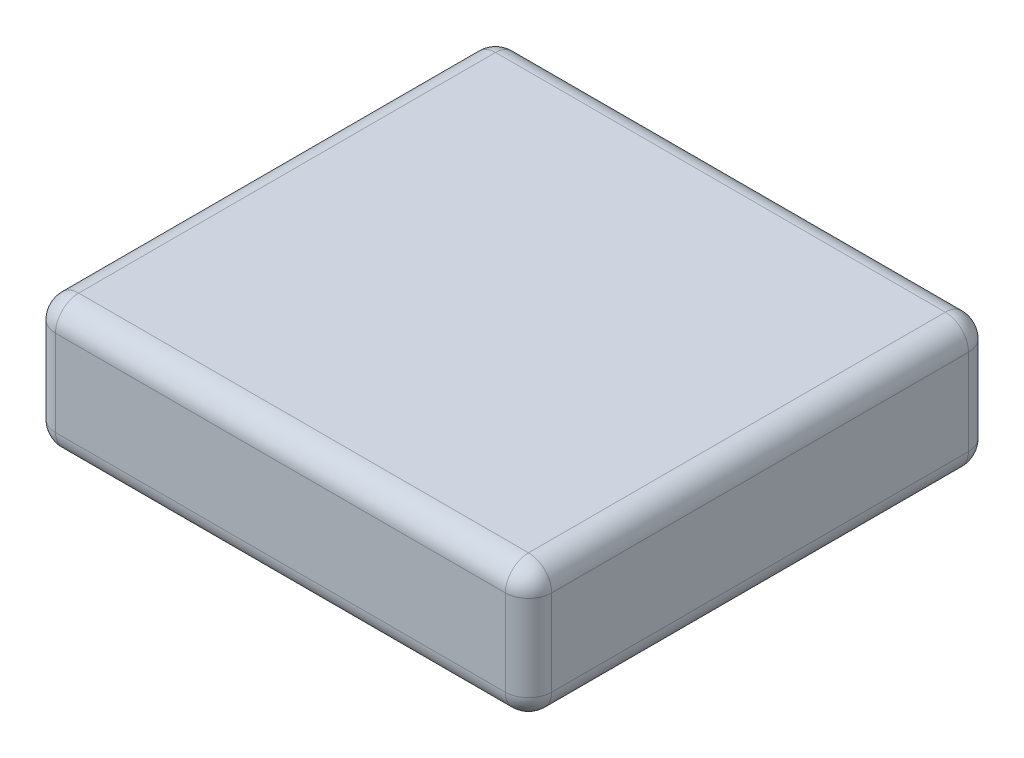
ISO-10303-21;
HEADER;
FILE_DESCRIPTION(('STEP AP214'),'2;1');
FILE_NAME('part.step','',(''),(''),'','','');
FILE_SCHEMA(('AUTOMOTIVE_DESIGN { 1 0 10303 214 1 1 1 1 }'));
ENDSEC;
DATA;
#1=APPLICATION_CONTEXT('core data for automotive mechanical design processes');
#2=APPLICATION_PROTOCOL_DEFINITION('international standard','automotive_design',2000,#1);
#3=PRODUCT_CONTEXT('',#1,'mechanical');
#4=PRODUCT('Part','Part','',(#3));
#5=PRODUCT_RELATED_PRODUCT_CATEGORY('part','',(#4));
#6=PRODUCT_DEFINITION_FORMATION('','',#4);
#7=PRODUCT_DEFINITION_CONTEXT('part definition',#1,'design');
#8=PRODUCT_DEFINITION('design','',#6,#7);
#9=PRODUCT_DEFINITION_SHAPE('','',#8);
#10=(LENGTH_UNIT() NAMED_UNIT(*) SI_UNIT(.MILLI.,.METRE.));
#11=(NAMED_UNIT(*) PLANE_ANGLE_UNIT() SI_UNIT($,.RADIAN.));
#12=(NAMED_UNIT(*) SI_UNIT($,.STERADIAN.) SOLID_ANGLE_UNIT());
#13=UNCERTAINTY_MEASURE_WITH_UNIT(LENGTH_MEASURE(1.E-05),#10,'distance_accuracy_value','');
#14=(GEOMETRIC_REPRESENTATION_CONTEXT(3) GLOBAL_UNCERTAINTY_ASSIGNED_CONTEXT((#13)) GLOBAL_UNIT_ASSIGNED_CONTEXT((#10,
#11,#12)) REPRESENTATION_CONTEXT('',''));
#15=CARTESIAN_POINT('',(0.,0.,0.));
#16=DIRECTION('',(0.,0.,1.));
#17=DIRECTION('',(1.,0.,0.));
#18=AXIS2_PLACEMENT_3D('',#15,#16,#17);
#19=CARTESIAN_POINT('',(0.,200.,0.));
#20=DIRECTION('',(1.,0.,0.));
#21=DIRECTION('',(0.,0.,-1.));
#22=AXIS2_PLACEMENT_3D('',#19,#20,#21);
#23=PLANE('',#22);
#24=DIRECTION('',(0.,-1.,0.));
#25=VECTOR('',#24,1.);
#26=CARTESIAN_POINT('',(0.,200.,-35.));
#27=LINE('',#26,#25);
#28=CARTESIAN_POINT('',(0.,35.,-35.));
#29=VERTEX_POINT('',#28);
#30=CARTESIAN_POINT('',(0.,165.,-35.));
#31=VERTEX_POINT('',#30);
#32=EDGE_CURVE('E129',#29,#31,#27,.F.);
#33=ORIENTED_EDGE('',*,*,#32,.T.);
#34=DIRECTION('',(0.,0.,1.));
#35=VECTOR('',#34,1.);
#36=CARTESIAN_POINT('',(0.,165.,0.));
#37=LINE('',#36,#35);
#38=CARTESIAN_POINT('',(0.,165.,-665.));
#39=VERTEX_POINT('',#38);
#40=EDGE_CURVE('E166',#31,#39,#37,.F.);
#41=ORIENTED_EDGE('',*,*,#40,.T.);
#42=DIRECTION('',(0.,-1.,0.));
#43=VECTOR('',#42,1.);
#44=CARTESIAN_POINT('',(0.,200.,-665.));
#45=LINE('',#44,#43);
#46=CARTESIAN_POINT('',(0.,35.,-665.));
#47=VERTEX_POINT('',#46);
#48=EDGE_CURVE('E163',#39,#47,#45,.T.);
#49=ORIENTED_EDGE('',*,*,#48,.T.);
#50=DIRECTION('',(0.,0.,1.));
#51=VECTOR('',#50,1.);
#52=CARTESIAN_POINT('',(0.,35.,0.));
#53=LINE('',#52,#51);
#54=EDGE_CURVE('E158',#47,#29,#53,.T.);
#55=ORIENTED_EDGE('',*,*,#54,.T.);
#56=EDGE_LOOP('',(#33,#41,#49,#55));
#57=FACE_BOUND('',#56,.T.);
#58=ADVANCED_FACE('F33',(#57),#23,.F.);
#59=CARTESIAN_POINT('',(0.,200.,0.));
#60=DIRECTION('',(0.,0.,-1.));
#61=DIRECTION('',(-1.,0.,0.));
#62=AXIS2_PLACEMENT_3D('',#59,#60,#61);
#63=PLANE('',#62);
#64=DIRECTION('',(0.,-1.,0.));
#65=VECTOR('',#64,1.);
#66=CARTESIAN_POINT('',(715.,200.,0.));
#67=LINE('',#66,#65);
#68=CARTESIAN_POINT('',(715.,35.,0.));
#69=VERTEX_POINT('',#68);
#70=CARTESIAN_POINT('',(715.,165.,0.));
#71=VERTEX_POINT('',#70);
#72=EDGE_CURVE('E151',#69,#71,#67,.F.);
#73=ORIENTED_EDGE('',*,*,#72,.T.);
#74=DIRECTION('',(1.,0.,0.));
#75=VECTOR('',#74,1.);
#76=CARTESIAN_POINT('',(0.,165.,0.));
#77=LINE('',#76,#75);
#78=CARTESIAN_POINT('',(35.,165.,0.));
#79=VERTEX_POINT('',#78);
#80=EDGE_CURVE('E155',#71,#79,#77,.F.);
#81=ORIENTED_EDGE('',*,*,#80,.T.);
#82=DIRECTION('',(0.,-1.,0.));
#83=VECTOR('',#82,1.);
#84=CARTESIAN_POINT('',(35.,200.,0.));
#85=LINE('',#84,#83);
#86=CARTESIAN_POINT('',(35.,35.,0.));
#87=VERTEX_POINT('',#86);
#88=EDGE_CURVE('E127',#79,#87,#85,.T.);
#89=ORIENTED_EDGE('',*,*,#88,.T.);
#90=DIRECTION('',(1.,0.,0.));
#91=VECTOR('',#90,1.);
#92=CARTESIAN_POINT('',(750.,35.,0.));
#93=LINE('',#92,#91);
#94=EDGE_CURVE('E145',#87,#69,#93,.T.);
#95=ORIENTED_EDGE('',*,*,#94,.T.);
#96=EDGE_LOOP('',(#73,#81,#89,#95));
#97=FACE_BOUND('',#96,.T.);
#98=ADVANCED_FACE('F153',(#97),#63,.F.);
#99=CARTESIAN_POINT('',(750.,200.,0.));
#100=DIRECTION('',(-1.,0.,0.));
#101=DIRECTION('',(0.,0.,1.));
#102=AXIS2_PLACEMENT_3D('',#99,#100,#101);
#103=PLANE('',#102);
#104=DIRECTION('',(0.,-1.,0.));
#105=VECTOR('',#104,1.);
#106=CARTESIAN_POINT('',(750.,200.,-665.));
#107=LINE('',#106,#105);
#108=CARTESIAN_POINT('',(750.,35.,-665.));
#109=VERTEX_POINT('',#108);
#110=CARTESIAN_POINT('',(750.,165.,-665.));
#111=VERTEX_POINT('',#110);
#112=EDGE_CURVE('E170',#109,#111,#107,.F.);
#113=ORIENTED_EDGE('',*,*,#112,.T.);
#114=DIRECTION('',(0.,0.,-1.));
#115=VECTOR('',#114,1.);
#116=CARTESIAN_POINT('',(750.,165.,0.));
#117=LINE('',#116,#115);
#118=CARTESIAN_POINT('',(750.,165.,-35.));
#119=VERTEX_POINT('',#118);
#120=EDGE_CURVE('E175',#111,#119,#117,.F.);
#121=ORIENTED_EDGE('',*,*,#120,.T.);
#122=DIRECTION('',(0.,-1.,0.));
#123=VECTOR('',#122,1.);
#124=CARTESIAN_POINT('',(750.,200.,-35.));
#125=LINE('',#124,#123);
#126=CARTESIAN_POINT('',(750.,35.,-35.));
#127=VERTEX_POINT('',#126);
#128=EDGE_CURVE('E172',#119,#127,#125,.T.);
#129=ORIENTED_EDGE('',*,*,#128,.T.);
#130=DIRECTION('',(0.,0.,-1.));
#131=VECTOR('',#130,1.);
#132=CARTESIAN_POINT('',(750.,35.,-700.));
#133=LINE('',#132,#131);
#134=EDGE_CURVE('E168',#127,#109,#133,.T.);
#135=ORIENTED_EDGE('',*,*,#134,.T.);
#136=EDGE_LOOP('',(#113,#121,#129,#135));
#137=FACE_BOUND('',#136,.T.);
#138=ADVANCED_FACE('F280',(#137),#103,.F.);
#139=CARTESIAN_POINT('',(0.,200.,-700.));
#140=DIRECTION('',(0.,0.,1.));
#141=DIRECTION('',(1.,0.,0.));
#142=AXIS2_PLACEMENT_3D('',#139,#140,#141);
#143=PLANE('',#142);
#144=DIRECTION('',(0.,-1.,0.));
#145=VECTOR('',#144,1.);
#146=CARTESIAN_POINT('',(35.,200.,-700.));
#147=LINE('',#146,#145);
#148=CARTESIAN_POINT('',(35.,35.,-700.));
#149=VERTEX_POINT('',#148);
#150=CARTESIAN_POINT('',(35.,165.,-700.));
#151=VERTEX_POINT('',#150);
#152=EDGE_CURVE('E179',#149,#151,#147,.F.);
#153=ORIENTED_EDGE('',*,*,#152,.T.);
#154=DIRECTION('',(-1.,0.,0.));
#155=VECTOR('',#154,1.);
#156=CARTESIAN_POINT('',(0.,165.,-700.));
#157=LINE('',#156,#155);
#158=CARTESIAN_POINT('',(715.,165.,-700.));
#159=VERTEX_POINT('',#158);
#160=EDGE_CURVE('E184',#151,#159,#157,.F.);
#161=ORIENTED_EDGE('',*,*,#160,.T.);
#162=DIRECTION('',(0.,-1.,0.));
#163=VECTOR('',#162,1.);
#164=CARTESIAN_POINT('',(715.,200.,-700.));
#165=LINE('',#164,#163);
#166=CARTESIAN_POINT('',(715.,35.,-700.));
#167=VERTEX_POINT('',#166);
#168=EDGE_CURVE('E181',#159,#167,#165,.T.);
#169=ORIENTED_EDGE('',*,*,#168,.T.);
#170=DIRECTION('',(-1.,0.,0.));
#171=VECTOR('',#170,1.);
#172=CARTESIAN_POINT('',(0.,35.,-700.));
#173=LINE('',#172,#171);
#174=EDGE_CURVE('E177',#167,#149,#173,.T.);
#175=ORIENTED_EDGE('',*,*,#174,.T.);
#176=EDGE_LOOP('',(#153,#161,#169,#175));
#177=FACE_BOUND('',#176,.T.);
#178=ADVANCED_FACE('F291',(#177),#143,.F.);
#179=CARTESIAN_POINT('',(0.,200.,0.));
#180=DIRECTION('',(0.,-1.,0.));
#181=DIRECTION('',(0.,0.,-1.));
#182=AXIS2_PLACEMENT_3D('',#179,#180,#181);
#183=PLANE('',#182);
#184=DIRECTION('',(0.,0.,-1.));
#185=VECTOR('',#184,1.);
#186=CARTESIAN_POINT('',(715.,200.,0.));
#187=LINE('',#186,#185);
#188=CARTESIAN_POINT('',(715.,200.,-35.));
#189=VERTEX_POINT('',#188);
#190=CARTESIAN_POINT('',(715.,200.,-665.));
#191=VERTEX_POINT('',#190);
#192=EDGE_CURVE('E190',#189,#191,#187,.T.);
#193=ORIENTED_EDGE('',*,*,#192,.T.);
#194=DIRECTION('',(-1.,0.,0.));
#195=VECTOR('',#194,1.);
#196=CARTESIAN_POINT('',(0.,200.,-665.));
#197=LINE('',#196,#195);
#198=CARTESIAN_POINT('',(35.,200.,-665.));
#199=VERTEX_POINT('',#198);
#200=EDGE_CURVE('E192',#191,#199,#197,.T.);
#201=ORIENTED_EDGE('',*,*,#200,.T.);
#202=DIRECTION('',(0.,0.,1.));
#203=VECTOR('',#202,1.);
#204=CARTESIAN_POINT('',(35.,200.,0.));
#205=LINE('',#204,#203);
#206=CARTESIAN_POINT('',(35.,200.,-35.));
#207=VERTEX_POINT('',#206);
#208=EDGE_CURVE('E186',#199,#207,#205,.T.);
#209=ORIENTED_EDGE('',*,*,#208,.T.);
#210=DIRECTION('',(1.,0.,0.));
#211=VECTOR('',#210,1.);
#212=CARTESIAN_POINT('',(0.,200.,-35.));
#213=LINE('',#212,#211);
#214=EDGE_CURVE('E188',#207,#189,#213,.T.);
#215=ORIENTED_EDGE('',*,*,#214,.T.);
#216=EDGE_LOOP('',(#193,#201,#209,#215));
#217=FACE_BOUND('',#216,.T.);
#218=ADVANCED_FACE('F272',(#217),#183,.F.);
#219=CARTESIAN_POINT('',(0.,0.,0.));
#220=DIRECTION('',(0.,-1.,0.));
#221=DIRECTION('',(0.,0.,-1.));
#222=AXIS2_PLACEMENT_3D('',#219,#220,#221);
#223=PLANE('',#222);
#224=DIRECTION('',(0.,0.,-1.));
#225=VECTOR('',#224,1.);
#226=CARTESIAN_POINT('',(715.,0.,0.));
#227=LINE('',#226,#225);
#228=CARTESIAN_POINT('',(715.,0.,-665.));
#229=VERTEX_POINT('',#228);
#230=CARTESIAN_POINT('',(715.,0.,-35.));
#231=VERTEX_POINT('',#230);
#232=EDGE_CURVE('E42',#229,#231,#227,.F.);
#233=ORIENTED_EDGE('',*,*,#232,.T.);
#234=DIRECTION('',(1.,0.,0.));
#235=VECTOR('',#234,1.);
#236=CARTESIAN_POINT('',(0.,0.,-35.));
#237=LINE('',#236,#235);
#238=CARTESIAN_POINT('',(35.,0.,-35.));
#239=VERTEX_POINT('',#238);
#240=EDGE_CURVE('E11',#231,#239,#237,.F.);
#241=ORIENTED_EDGE('',*,*,#240,.T.);
#242=DIRECTION('',(0.,0.,1.));
#243=VECTOR('',#242,1.);
#244=CARTESIAN_POINT('',(35.,0.,-700.));
#245=LINE('',#244,#243);
#246=CARTESIAN_POINT('',(35.,0.,-665.));
#247=VERTEX_POINT('',#246);
#248=EDGE_CURVE('E195',#239,#247,#245,.F.);
#249=ORIENTED_EDGE('',*,*,#248,.T.);
#250=DIRECTION('',(-1.,0.,0.));
#251=VECTOR('',#250,1.);
#252=CARTESIAN_POINT('',(750.,0.,-665.));
#253=LINE('',#252,#251);
#254=EDGE_CURVE('E53',#247,#229,#253,.F.);
#255=ORIENTED_EDGE('',*,*,#254,.T.);
#256=EDGE_LOOP('',(#233,#241,#249,#255));
#257=FACE_BOUND('',#256,.T.);
#258=ADVANCED_FACE('F478',(#257),#223,.T.);
#259=CARTESIAN_POINT('',(715.,200.,-665.));
#260=DIRECTION('',(0.,-1.,0.));
#261=DIRECTION('',(0.,0.,-1.));
#262=AXIS2_PLACEMENT_3D('',#259,#260,#261);
#263=CYLINDRICAL_SURFACE('',#262,35.);
#264=CARTESIAN_POINT('',(715.,165.,-665.));
#265=DIRECTION('',(0.,1.,0.));
#266=DIRECTION('',(0.,0.,1.));
#267=AXIS2_PLACEMENT_3D('',#264,#265,#266);
#268=CIRCLE('',#267,35.);
#269=EDGE_CURVE('E37',#111,#159,#268,.T.);
#270=ORIENTED_EDGE('',*,*,#269,.F.);
#271=ORIENTED_EDGE('',*,*,#112,.F.);
#272=CARTESIAN_POINT('',(715.,35.,-665.));
#273=DIRECTION('',(0.,-1.,0.));
#274=DIRECTION('',(0.,0.,-1.));
#275=AXIS2_PLACEMENT_3D('',#272,#273,#274);
#276=CIRCLE('',#275,35.);
#277=EDGE_CURVE('E249',#167,#109,#276,.T.);
#278=ORIENTED_EDGE('',*,*,#277,.F.);
#279=ORIENTED_EDGE('',*,*,#168,.F.);
#280=EDGE_LOOP('',(#270,#271,#278,#279));
#281=FACE_BOUND('',#280,.T.);
#282=ADVANCED_FACE('F35',(#281),#263,.T.);
#283=CARTESIAN_POINT('',(715.,165.,-665.));
#284=DIRECTION('',(0.,0.,1.));
#285=DIRECTION('',(1.,0.,0.));
#286=AXIS2_PLACEMENT_3D('',#283,#284,#285);
#287=SPHERICAL_SURFACE('',#286,35.);
#288=CARTESIAN_POINT('',(715.,165.,-665.));
#289=DIRECTION('',(0.,0.,-1.));
#290=DIRECTION('',(-1.,0.,0.));
#291=AXIS2_PLACEMENT_3D('',#288,#289,#290);
#292=CIRCLE('',#291,35.);
#293=EDGE_CURVE('E244',#111,#191,#292,.F.);
#294=ORIENTED_EDGE('',*,*,#293,.F.);
#295=ORIENTED_EDGE('',*,*,#269,.T.);
#296=CARTESIAN_POINT('',(715.,165.,-665.));
#297=DIRECTION('',(1.,0.,0.));
#298=DIRECTION('',(0.,0.,-1.));
#299=AXIS2_PLACEMENT_3D('',#296,#297,#298);
#300=CIRCLE('',#299,35.);
#301=EDGE_CURVE('E247',#191,#159,#300,.F.);
#302=ORIENTED_EDGE('',*,*,#301,.F.);
#303=EDGE_LOOP('',(#294,#295,#302));
#304=FACE_BOUND('',#303,.T.);
#305=ADVANCED_FACE('F260',(#304),#287,.T.);
#306=CARTESIAN_POINT('',(715.,35.,-665.));
#307=DIRECTION('',(0.,0.,1.));
#308=DIRECTION('',(1.,0.,0.));
#309=AXIS2_PLACEMENT_3D('',#306,#307,#308);
#310=SPHERICAL_SURFACE('',#309,35.);
#311=CARTESIAN_POINT('',(715.,35.,-665.));
#312=DIRECTION('',(1.,0.,0.));
#313=DIRECTION('',(0.,0.,-1.));
#314=AXIS2_PLACEMENT_3D('',#311,#312,#313);
#315=CIRCLE('',#314,35.);
#316=EDGE_CURVE('E239',#167,#229,#315,.F.);
#317=ORIENTED_EDGE('',*,*,#316,.F.);
#318=ORIENTED_EDGE('',*,*,#277,.T.);
#319=CARTESIAN_POINT('',(715.,35.,-665.));
#320=DIRECTION('',(0.,0.,-1.));
#321=DIRECTION('',(-1.,0.,0.));
#322=AXIS2_PLACEMENT_3D('',#319,#320,#321);
#323=CIRCLE('',#322,35.);
#324=EDGE_CURVE('E241',#229,#109,#323,.F.);
#325=ORIENTED_EDGE('',*,*,#324,.F.);
#326=EDGE_LOOP('',(#317,#318,#325));
#327=FACE_BOUND('',#326,.T.);
#328=ADVANCED_FACE('F457',(#327),#310,.T.);
#329=CARTESIAN_POINT('',(0.,165.,-665.));
#330=DIRECTION('',(-1.,0.,0.));
#331=DIRECTION('',(0.,0.,1.));
#332=AXIS2_PLACEMENT_3D('',#329,#330,#331);
#333=CYLINDRICAL_SURFACE('',#332,35.);
#334=ORIENTED_EDGE('',*,*,#301,.T.);
#335=ORIENTED_EDGE('',*,*,#160,.F.);
#336=CARTESIAN_POINT('',(35.,165.,-665.));
#337=DIRECTION('',(-1.,0.,0.));
#338=DIRECTION('',(0.,0.,1.));
#339=AXIS2_PLACEMENT_3D('',#336,#337,#338);
#340=CIRCLE('',#339,35.);
#341=EDGE_CURVE('E233',#199,#151,#340,.T.);
#342=ORIENTED_EDGE('',*,*,#341,.F.);
#343=ORIENTED_EDGE('',*,*,#200,.F.);
#344=EDGE_LOOP('',(#334,#335,#342,#343));
#345=FACE_BOUND('',#344,.T.);
#346=ADVANCED_FACE('F268',(#345),#333,.T.);
#347=CARTESIAN_POINT('',(715.,165.,0.));
#348=DIRECTION('',(0.,0.,-1.));
#349=DIRECTION('',(-1.,0.,0.));
#350=AXIS2_PLACEMENT_3D('',#347,#348,#349);
#351=CYLINDRICAL_SURFACE('',#350,35.);
#352=ORIENTED_EDGE('',*,*,#293,.T.);
#353=ORIENTED_EDGE('',*,*,#192,.F.);
#354=CARTESIAN_POINT('',(715.,165.,-35.));
#355=DIRECTION('',(0.,0.,1.));
#356=DIRECTION('',(1.,0.,0.));
#357=AXIS2_PLACEMENT_3D('',#354,#355,#356);
#358=CIRCLE('',#357,35.);
#359=EDGE_CURVE('E230',#119,#189,#358,.T.);
#360=ORIENTED_EDGE('',*,*,#359,.F.);
#361=ORIENTED_EDGE('',*,*,#120,.F.);
#362=EDGE_LOOP('',(#352,#353,#360,#361));
#363=FACE_BOUND('',#362,.T.);
#364=ADVANCED_FACE('F277',(#363),#351,.T.);
#365=CARTESIAN_POINT('',(715.,200.,-35.));
#366=DIRECTION('',(0.,-1.,0.));
#367=DIRECTION('',(0.,0.,-1.));
#368=AXIS2_PLACEMENT_3D('',#365,#366,#367);
#369=CYLINDRICAL_SURFACE('',#368,35.);
#370=CARTESIAN_POINT('',(715.,35.,-35.));
#371=DIRECTION('',(0.,-1.,0.));
#372=DIRECTION('',(0.,0.,-1.));
#373=AXIS2_PLACEMENT_3D('',#370,#371,#372);
#374=CIRCLE('',#373,35.);
#375=EDGE_CURVE('E224',#127,#69,#374,.T.);
#376=ORIENTED_EDGE('',*,*,#375,.F.);
#377=ORIENTED_EDGE('',*,*,#128,.F.);
#378=CARTESIAN_POINT('',(715.,165.,-35.));
#379=DIRECTION('',(0.,1.,0.));
#380=DIRECTION('',(0.,0.,1.));
#381=AXIS2_PLACEMENT_3D('',#378,#379,#380);
#382=CIRCLE('',#381,35.);
#383=EDGE_CURVE('E227',#71,#119,#382,.T.);
#384=ORIENTED_EDGE('',*,*,#383,.F.);
#385=ORIENTED_EDGE('',*,*,#72,.F.);
#386=EDGE_LOOP('',(#376,#377,#384,#385));
#387=FACE_BOUND('',#386,.T.);
#388=ADVANCED_FACE('F284',(#387),#369,.T.);
#389=CARTESIAN_POINT('',(715.,35.,0.));
#390=DIRECTION('',(0.,0.,1.));
#391=DIRECTION('',(1.,0.,0.));
#392=AXIS2_PLACEMENT_3D('',#389,#390,#391);
#393=CYLINDRICAL_SURFACE('',#392,35.);
#394=ORIENTED_EDGE('',*,*,#324,.T.);
#395=ORIENTED_EDGE('',*,*,#134,.F.);
#396=CARTESIAN_POINT('',(715.,35.,-35.));
#397=DIRECTION('',(0.,0.,1.));
#398=DIRECTION('',(1.,0.,0.));
#399=AXIS2_PLACEMENT_3D('',#396,#397,#398);
#400=CIRCLE('',#399,35.);
#401=EDGE_CURVE('E222',#231,#127,#400,.T.);
#402=ORIENTED_EDGE('',*,*,#401,.F.);
#403=ORIENTED_EDGE('',*,*,#232,.F.);
#404=EDGE_LOOP('',(#394,#395,#402,#403));
#405=FACE_BOUND('',#404,.T.);
#406=ADVANCED_FACE('F289',(#405),#393,.T.);
#407=CARTESIAN_POINT('',(0.,35.,-665.));
#408=DIRECTION('',(1.,0.,0.));
#409=DIRECTION('',(0.,0.,-1.));
#410=AXIS2_PLACEMENT_3D('',#407,#408,#409);
#411=CYLINDRICAL_SURFACE('',#410,35.);
#412=ORIENTED_EDGE('',*,*,#316,.T.);
#413=ORIENTED_EDGE('',*,*,#254,.F.);
#414=CARTESIAN_POINT('',(35.,35.,-665.));
#415=DIRECTION('',(-1.,0.,0.));
#416=DIRECTION('',(0.,0.,1.));
#417=AXIS2_PLACEMENT_3D('',#414,#415,#416);
#418=CIRCLE('',#417,35.);
#419=EDGE_CURVE('E219',#149,#247,#418,.T.);
#420=ORIENTED_EDGE('',*,*,#419,.F.);
#421=ORIENTED_EDGE('',*,*,#174,.F.);
#422=EDGE_LOOP('',(#412,#413,#420,#421));
#423=FACE_BOUND('',#422,.T.);
#424=ADVANCED_FACE('F300',(#423),#411,.T.);
#425=CARTESIAN_POINT('',(35.,200.,-665.));
#426=DIRECTION('',(0.,-1.,0.));
#427=DIRECTION('',(0.,0.,-1.));
#428=AXIS2_PLACEMENT_3D('',#425,#426,#427);
#429=CYLINDRICAL_SURFACE('',#428,35.);
#430=CARTESIAN_POINT('',(35.,165.,-665.));
#431=DIRECTION('',(0.,1.,0.));
#432=DIRECTION('',(0.,0.,1.));
#433=AXIS2_PLACEMENT_3D('',#430,#431,#432);
#434=CIRCLE('',#433,35.);
#435=EDGE_CURVE('E236',#151,#39,#434,.T.);
#436=ORIENTED_EDGE('',*,*,#435,.F.);
#437=ORIENTED_EDGE('',*,*,#152,.F.);
#438=CARTESIAN_POINT('',(35.,35.,-665.));
#439=DIRECTION('',(0.,-1.,0.));
#440=DIRECTION('',(0.,0.,-1.));
#441=AXIS2_PLACEMENT_3D('',#438,#439,#440);
#442=CIRCLE('',#441,35.);
#443=EDGE_CURVE('E216',#47,#149,#442,.T.);
#444=ORIENTED_EDGE('',*,*,#443,.F.);
#445=ORIENTED_EDGE('',*,*,#48,.F.);
#446=EDGE_LOOP('',(#436,#437,#444,#445));
#447=FACE_BOUND('',#446,.T.);
#448=ADVANCED_FACE('F296',(#447),#429,.T.);
#449=CARTESIAN_POINT('',(35.,165.,-665.));
#450=DIRECTION('',(0.,0.,1.));
#451=DIRECTION('',(1.,0.,0.));
#452=AXIS2_PLACEMENT_3D('',#449,#450,#451);
#453=SPHERICAL_SURFACE('',#452,35.);
#454=ORIENTED_EDGE('',*,*,#341,.T.);
#455=ORIENTED_EDGE('',*,*,#435,.T.);
#456=CARTESIAN_POINT('',(35.,165.,-665.));
#457=DIRECTION('',(0.,0.,-1.));
#458=DIRECTION('',(-1.,0.,0.));
#459=AXIS2_PLACEMENT_3D('',#456,#457,#458);
#460=CIRCLE('',#459,35.);
#461=EDGE_CURVE('E213',#199,#39,#460,.F.);
#462=ORIENTED_EDGE('',*,*,#461,.F.);
#463=EDGE_LOOP('',(#454,#455,#462));
#464=FACE_BOUND('',#463,.T.);
#465=ADVANCED_FACE('F310',(#464),#453,.T.);
#466=CARTESIAN_POINT('',(715.,165.,-35.));
#467=DIRECTION('',(0.,0.,1.));
#468=DIRECTION('',(1.,0.,0.));
#469=AXIS2_PLACEMENT_3D('',#466,#467,#468);
#470=SPHERICAL_SURFACE('',#469,35.);
#471=ORIENTED_EDGE('',*,*,#383,.T.);
#472=ORIENTED_EDGE('',*,*,#359,.T.);
#473=CARTESIAN_POINT('',(715.,165.,-35.));
#474=DIRECTION('',(1.,0.,0.));
#475=DIRECTION('',(0.,0.,-1.));
#476=AXIS2_PLACEMENT_3D('',#473,#474,#475);
#477=CIRCLE('',#476,35.);
#478=EDGE_CURVE('E210',#71,#189,#477,.F.);
#479=ORIENTED_EDGE('',*,*,#478,.F.);
#480=EDGE_LOOP('',(#471,#472,#479));
#481=FACE_BOUND('',#480,.T.);
#482=ADVANCED_FACE('F320',(#481),#470,.T.);
#483=CARTESIAN_POINT('',(715.,35.,-35.));
#484=DIRECTION('',(0.,0.,1.));
#485=DIRECTION('',(1.,0.,0.));
#486=AXIS2_PLACEMENT_3D('',#483,#484,#485);
#487=SPHERICAL_SURFACE('',#486,35.);
#488=ORIENTED_EDGE('',*,*,#401,.T.);
#489=ORIENTED_EDGE('',*,*,#375,.T.);
#490=CARTESIAN_POINT('',(715.,35.,-35.));
#491=DIRECTION('',(1.,0.,0.));
#492=DIRECTION('',(0.,0.,-1.));
#493=AXIS2_PLACEMENT_3D('',#490,#491,#492);
#494=CIRCLE('',#493,35.);
#495=EDGE_CURVE('E148',#231,#69,#494,.F.);
#496=ORIENTED_EDGE('',*,*,#495,.F.);
#497=EDGE_LOOP('',(#488,#489,#496));
#498=FACE_BOUND('',#497,.T.);
#499=ADVANCED_FACE('F322',(#498),#487,.T.);
#500=CARTESIAN_POINT('',(35.,35.,-665.));
#501=DIRECTION('',(0.,0.,1.));
#502=DIRECTION('',(1.,0.,0.));
#503=AXIS2_PLACEMENT_3D('',#500,#501,#502);
#504=SPHERICAL_SURFACE('',#503,35.);
#505=ORIENTED_EDGE('',*,*,#443,.T.);
#506=ORIENTED_EDGE('',*,*,#419,.T.);
#507=CARTESIAN_POINT('',(35.,35.,-665.));
#508=DIRECTION('',(0.,0.,-1.));
#509=DIRECTION('',(-1.,0.,0.));
#510=AXIS2_PLACEMENT_3D('',#507,#508,#509);
#511=CIRCLE('',#510,35.);
#512=EDGE_CURVE('E206',#47,#247,#511,.F.);
#513=ORIENTED_EDGE('',*,*,#512,.F.);
#514=EDGE_LOOP('',(#505,#506,#513));
#515=FACE_BOUND('',#514,.T.);
#516=ADVANCED_FACE('F302',(#515),#504,.T.);
#517=CARTESIAN_POINT('',(35.,165.,0.));
#518=DIRECTION('',(0.,0.,1.));
#519=DIRECTION('',(1.,0.,0.));
#520=AXIS2_PLACEMENT_3D('',#517,#518,#519);
#521=CYLINDRICAL_SURFACE('',#520,35.);
#522=ORIENTED_EDGE('',*,*,#461,.T.);
#523=ORIENTED_EDGE('',*,*,#40,.F.);
#524=CARTESIAN_POINT('',(35.,165.,-35.));
#525=DIRECTION('',(0.,0.,1.));
#526=DIRECTION('',(1.,0.,0.));
#527=AXIS2_PLACEMENT_3D('',#524,#525,#526);
#528=CIRCLE('',#527,35.);
#529=EDGE_CURVE('E203',#207,#31,#528,.T.);
#530=ORIENTED_EDGE('',*,*,#529,.F.);
#531=ORIENTED_EDGE('',*,*,#208,.F.);
#532=EDGE_LOOP('',(#522,#523,#530,#531));
#533=FACE_BOUND('',#532,.T.);
#534=ADVANCED_FACE('F312',(#533),#521,.T.);
#535=CARTESIAN_POINT('',(0.,165.,-35.));
#536=DIRECTION('',(1.,0.,0.));
#537=DIRECTION('',(0.,0.,-1.));
#538=AXIS2_PLACEMENT_3D('',#535,#536,#537);
#539=CYLINDRICAL_SURFACE('',#538,35.);
#540=ORIENTED_EDGE('',*,*,#478,.T.);
#541=ORIENTED_EDGE('',*,*,#214,.F.);
#542=CARTESIAN_POINT('',(35.,165.,-35.));
#543=DIRECTION('',(-1.,0.,0.));
#544=DIRECTION('',(0.,0.,1.));
#545=AXIS2_PLACEMENT_3D('',#542,#543,#544);
#546=CIRCLE('',#545,35.);
#547=EDGE_CURVE('E142',#79,#207,#546,.T.);
#548=ORIENTED_EDGE('',*,*,#547,.F.);
#549=ORIENTED_EDGE('',*,*,#80,.F.);
#550=EDGE_LOOP('',(#540,#541,#548,#549));
#551=FACE_BOUND('',#550,.T.);
#552=ADVANCED_FACE('F318',(#551),#539,.T.);
#553=CARTESIAN_POINT('',(0.,35.,-35.));
#554=DIRECTION('',(-1.,0.,0.));
#555=DIRECTION('',(0.,0.,1.));
#556=AXIS2_PLACEMENT_3D('',#553,#554,#555);
#557=CYLINDRICAL_SURFACE('',#556,35.);
#558=ORIENTED_EDGE('',*,*,#495,.T.);
#559=ORIENTED_EDGE('',*,*,#94,.F.);
#560=CARTESIAN_POINT('',(35.,35.,-35.));
#561=DIRECTION('',(-1.,0.,0.));
#562=DIRECTION('',(0.,0.,1.));
#563=AXIS2_PLACEMENT_3D('',#560,#561,#562);
#564=CIRCLE('',#563,35.);
#565=EDGE_CURVE('E134',#239,#87,#564,.T.);
#566=ORIENTED_EDGE('',*,*,#565,.F.);
#567=ORIENTED_EDGE('',*,*,#240,.F.);
#568=EDGE_LOOP('',(#558,#559,#566,#567));
#569=FACE_BOUND('',#568,.T.);
#570=ADVANCED_FACE('F146',(#569),#557,.T.);
#571=CARTESIAN_POINT('',(35.,35.,0.));
#572=DIRECTION('',(0.,0.,-1.));
#573=DIRECTION('',(-1.,0.,0.));
#574=AXIS2_PLACEMENT_3D('',#571,#572,#573);
#575=CYLINDRICAL_SURFACE('',#574,35.);
#576=ORIENTED_EDGE('',*,*,#512,.T.);
#577=ORIENTED_EDGE('',*,*,#248,.F.);
#578=CARTESIAN_POINT('',(35.,35.,-35.));
#579=DIRECTION('',(0.,0.,1.));
#580=DIRECTION('',(1.,0.,0.));
#581=AXIS2_PLACEMENT_3D('',#578,#579,#580);
#582=CIRCLE('',#581,35.);
#583=EDGE_CURVE('E138',#29,#239,#582,.T.);
#584=ORIENTED_EDGE('',*,*,#583,.F.);
#585=ORIENTED_EDGE('',*,*,#54,.F.);
#586=EDGE_LOOP('',(#576,#577,#584,#585));
#587=FACE_BOUND('',#586,.T.);
#588=ADVANCED_FACE('F305',(#587),#575,.T.);
#589=CARTESIAN_POINT('',(35.,165.,-35.));
#590=DIRECTION('',(0.,0.,1.));
#591=DIRECTION('',(1.,0.,0.));
#592=AXIS2_PLACEMENT_3D('',#589,#590,#591);
#593=SPHERICAL_SURFACE('',#592,35.);
#594=ORIENTED_EDGE('',*,*,#547,.T.);
#595=ORIENTED_EDGE('',*,*,#529,.T.);
#596=CARTESIAN_POINT('',(35.,165.,-35.));
#597=DIRECTION('',(0.,1.,0.));
#598=DIRECTION('',(0.,0.,1.));
#599=AXIS2_PLACEMENT_3D('',#596,#597,#598);
#600=CIRCLE('',#599,35.);
#601=EDGE_CURVE('E131',#79,#31,#600,.F.);
#602=ORIENTED_EDGE('',*,*,#601,.F.);
#603=EDGE_LOOP('',(#594,#595,#602));
#604=FACE_BOUND('',#603,.T.);
#605=ADVANCED_FACE('F316',(#604),#593,.T.);
#606=CARTESIAN_POINT('',(35.,35.,-35.));
#607=DIRECTION('',(0.,0.,1.));
#608=DIRECTION('',(1.,0.,0.));
#609=AXIS2_PLACEMENT_3D('',#606,#607,#608);
#610=SPHERICAL_SURFACE('',#609,35.);
#611=ORIENTED_EDGE('',*,*,#583,.T.);
#612=ORIENTED_EDGE('',*,*,#565,.T.);
#613=CARTESIAN_POINT('',(35.,35.,-35.));
#614=DIRECTION('',(0.,-1.,0.));
#615=DIRECTION('',(0.,0.,-1.));
#616=AXIS2_PLACEMENT_3D('',#613,#614,#615);
#617=CIRCLE('',#616,35.);
#618=EDGE_CURVE('E123',#29,#87,#617,.F.);
#619=ORIENTED_EDGE('',*,*,#618,.F.);
#620=EDGE_LOOP('',(#611,#612,#619));
#621=FACE_BOUND('',#620,.T.);
#622=ADVANCED_FACE('F136',(#621),#610,.T.);
#623=CARTESIAN_POINT('',(35.,200.,-35.));
#624=DIRECTION('',(0.,-1.,0.));
#625=DIRECTION('',(0.,0.,-1.));
#626=AXIS2_PLACEMENT_3D('',#623,#624,#625);
#627=CYLINDRICAL_SURFACE('',#626,35.);
#628=ORIENTED_EDGE('',*,*,#601,.T.);
#629=ORIENTED_EDGE('',*,*,#32,.F.);
#630=ORIENTED_EDGE('',*,*,#618,.T.);
#631=ORIENTED_EDGE('',*,*,#88,.F.);
#632=EDGE_LOOP('',(#628,#629,#630,#631));
#633=FACE_BOUND('',#632,.T.);
#634=ADVANCED_FACE('F125',(#633),#627,.T.);
#635=CLOSED_SHELL('',(#58,#98,#138,#178,#218,#258,#282,#305,#328,#346,#364,#388,#406,#424,#448,
#465,#482,#499,#516,#534,#552,#570,#588,#605,#622,#634));
#636=MANIFOLD_SOLID_BREP('B2',#635);
#637=ADVANCED_BREP_SHAPE_REPRESENTATION('',(#18,#636),#14);
#638=SHAPE_DEFINITION_REPRESENTATION(#9,#637);
ENDSEC;
END-ISO-10303-21;
